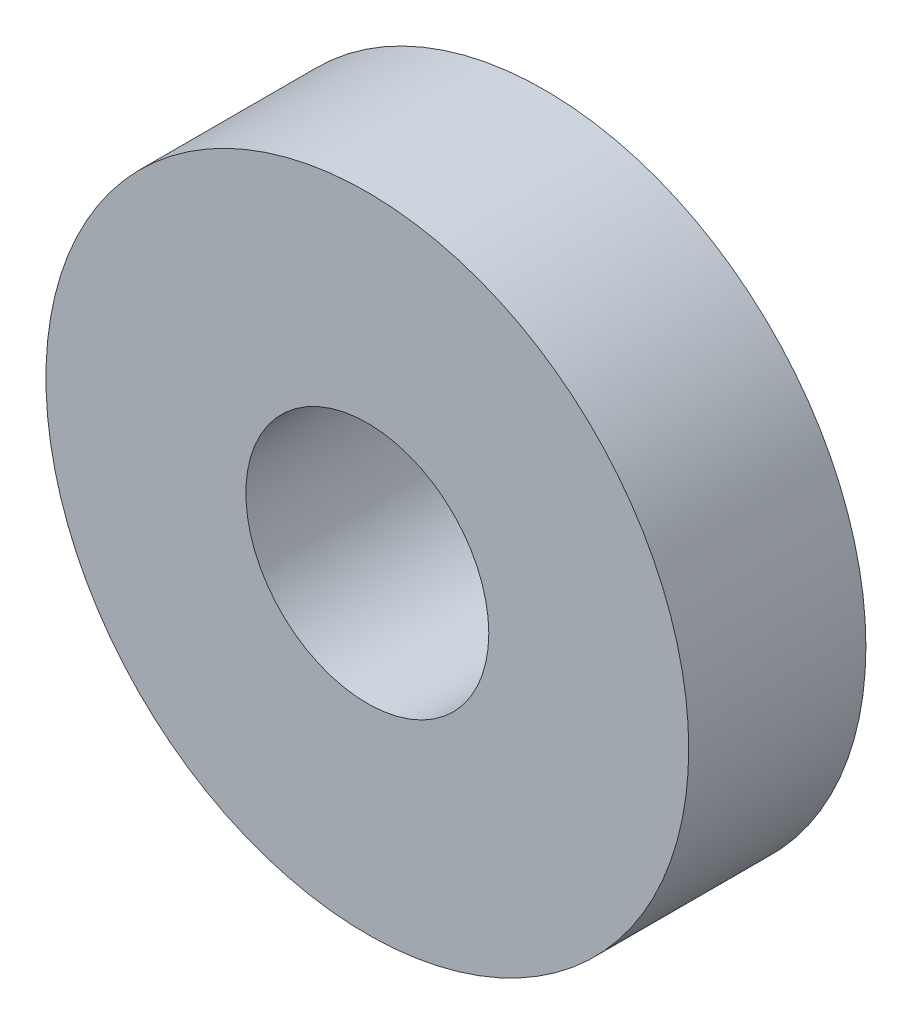
ISO-10303-21;
HEADER;
FILE_DESCRIPTION(('STEP AP214'),'2;1');
FILE_NAME('part.step','',(''),(''),'','','');
FILE_SCHEMA(('AUTOMOTIVE_DESIGN { 1 0 10303 214 1 1 1 1 }'));
ENDSEC;
DATA;
#1=APPLICATION_CONTEXT('core data for automotive mechanical design processes');
#2=APPLICATION_PROTOCOL_DEFINITION('international standard','automotive_design',2000,#1);
#3=PRODUCT_CONTEXT('',#1,'mechanical');
#4=PRODUCT('Part','Part','',(#3));
#5=PRODUCT_RELATED_PRODUCT_CATEGORY('part','',(#4));
#6=PRODUCT_DEFINITION_FORMATION('','',#4);
#7=PRODUCT_DEFINITION_CONTEXT('part definition',#1,'design');
#8=PRODUCT_DEFINITION('design','',#6,#7);
#9=PRODUCT_DEFINITION_SHAPE('','',#8);
#10=(LENGTH_UNIT() NAMED_UNIT(*) SI_UNIT(.MILLI.,.METRE.));
#11=(NAMED_UNIT(*) PLANE_ANGLE_UNIT() SI_UNIT($,.RADIAN.));
#12=(NAMED_UNIT(*) SI_UNIT($,.STERADIAN.) SOLID_ANGLE_UNIT());
#13=UNCERTAINTY_MEASURE_WITH_UNIT(LENGTH_MEASURE(1.E-05),#10,'distance_accuracy_value','');
#14=(GEOMETRIC_REPRESENTATION_CONTEXT(3) GLOBAL_UNCERTAINTY_ASSIGNED_CONTEXT((#13)) GLOBAL_UNIT_ASSIGNED_CONTEXT((#10,
#11,#12)) REPRESENTATION_CONTEXT('',''));
#15=CARTESIAN_POINT('',(0.,0.,0.));
#16=DIRECTION('',(0.,0.,1.));
#17=DIRECTION('',(1.,0.,0.));
#18=AXIS2_PLACEMENT_3D('',#15,#16,#17);
#19=CARTESIAN_POINT('',(0.,0.,7.));
#20=DIRECTION('',(0.,0.,1.));
#21=DIRECTION('',(1.,0.,0.));
#22=AXIS2_PLACEMENT_3D('',#19,#20,#21);
#23=PLANE('',#22);
#24=CARTESIAN_POINT('',(0.,0.,7.));
#25=DIRECTION('',(0.,0.,1.));
#26=DIRECTION('',(1.,0.,0.));
#27=AXIS2_PLACEMENT_3D('',#24,#25,#26);
#28=CIRCLE('',#27,12.7);
#29=CARTESIAN_POINT('',(12.7,0.,7.));
#30=VERTEX_POINT('',#29);
#31=EDGE_CURVE('E10',#30,#30,#28,.T.);
#32=ORIENTED_EDGE('',*,*,#31,.T.);
#33=EDGE_LOOP('',(#32));
#34=FACE_BOUND('',#33,.T.);
#35=CARTESIAN_POINT('',(0.,0.,7.));
#36=DIRECTION('',(0.,0.,1.));
#37=DIRECTION('',(1.,0.,0.));
#38=AXIS2_PLACEMENT_3D('',#35,#36,#37);
#39=CIRCLE('',#38,4.8);
#40=CARTESIAN_POINT('',(4.8,0.,7.));
#41=VERTEX_POINT('',#40);
#42=EDGE_CURVE('E44',#41,#41,#39,.T.);
#43=ORIENTED_EDGE('',*,*,#42,.F.);
#44=EDGE_LOOP('',(#43));
#45=FACE_BOUND('',#44,.T.);
#46=ADVANCED_FACE('F33',(#34,#45),#23,.T.);
#47=CARTESIAN_POINT('',(0.,0.,0.));
#48=DIRECTION('',(0.,0.,1.));
#49=DIRECTION('',(1.,0.,0.));
#50=AXIS2_PLACEMENT_3D('',#47,#48,#49);
#51=PLANE('',#50);
#52=CARTESIAN_POINT('',(0.,0.,0.));
#53=DIRECTION('',(0.,0.,1.));
#54=DIRECTION('',(1.,0.,0.));
#55=AXIS2_PLACEMENT_3D('',#52,#53,#54);
#56=CIRCLE('',#55,12.7);
#57=CARTESIAN_POINT('',(12.7,0.,0.));
#58=VERTEX_POINT('',#57);
#59=EDGE_CURVE('E37',#58,#58,#56,.T.);
#60=ORIENTED_EDGE('',*,*,#59,.F.);
#61=EDGE_LOOP('',(#60));
#62=FACE_BOUND('',#61,.T.);
#63=CARTESIAN_POINT('',(0.,0.,0.));
#64=DIRECTION('',(0.,0.,1.));
#65=DIRECTION('',(1.,0.,0.));
#66=AXIS2_PLACEMENT_3D('',#63,#64,#65);
#67=CIRCLE('',#66,4.8);
#68=CARTESIAN_POINT('',(4.8,0.,0.));
#69=VERTEX_POINT('',#68);
#70=EDGE_CURVE('E46',#69,#69,#67,.T.);
#71=ORIENTED_EDGE('',*,*,#70,.T.);
#72=EDGE_LOOP('',(#71));
#73=FACE_BOUND('',#72,.T.);
#74=ADVANCED_FACE('F56',(#62,#73),#51,.F.);
#75=CARTESIAN_POINT('',(0.,0.,7.));
#76=DIRECTION('',(0.,0.,-1.));
#77=DIRECTION('',(-1.,0.,0.));
#78=AXIS2_PLACEMENT_3D('',#75,#76,#77);
#79=CYLINDRICAL_SURFACE('',#78,12.7);
#80=ORIENTED_EDGE('',*,*,#31,.F.);
#81=EDGE_LOOP('',(#80));
#82=FACE_BOUND('',#81,.T.);
#83=ORIENTED_EDGE('',*,*,#59,.T.);
#84=EDGE_LOOP('',(#83));
#85=FACE_BOUND('',#84,.T.);
#86=ADVANCED_FACE('F35',(#82,#85),#79,.T.);
#87=CARTESIAN_POINT('',(0.,0.,7.));
#88=DIRECTION('',(0.,0.,-1.));
#89=DIRECTION('',(-1.,0.,0.));
#90=AXIS2_PLACEMENT_3D('',#87,#88,#89);
#91=CYLINDRICAL_SURFACE('',#90,4.8);
#92=ORIENTED_EDGE('',*,*,#42,.T.);
#93=EDGE_LOOP('',(#92));
#94=FACE_BOUND('',#93,.T.);
#95=ORIENTED_EDGE('',*,*,#70,.F.);
#96=EDGE_LOOP('',(#95));
#97=FACE_BOUND('',#96,.T.);
#98=ADVANCED_FACE('F52',(#94,#97),#91,.F.);
#99=CLOSED_SHELL('',(#46,#74,#86,#98));
#100=MANIFOLD_SOLID_BREP('B2',#99);
#101=ADVANCED_BREP_SHAPE_REPRESENTATION('',(#18,#100),#14);
#102=SHAPE_DEFINITION_REPRESENTATION(#9,#101);
ENDSEC;
END-ISO-10303-21;
